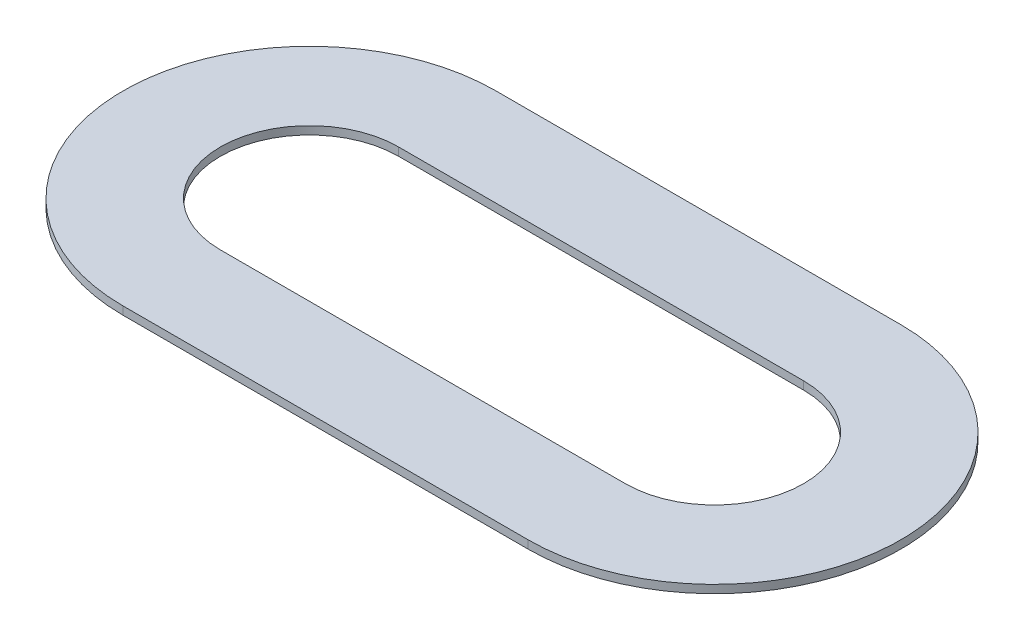
ISO-10303-21;
HEADER;
FILE_DESCRIPTION(('STEP AP214'),'2;1');
FILE_NAME('part.step','',(''),(''),'','','');
FILE_SCHEMA(('AUTOMOTIVE_DESIGN { 1 0 10303 214 1 1 1 1 }'));
ENDSEC;
DATA;
#1=APPLICATION_CONTEXT('core data for automotive mechanical design processes');
#2=APPLICATION_PROTOCOL_DEFINITION('international standard','automotive_design',2000,#1);
#3=PRODUCT_CONTEXT('',#1,'mechanical');
#4=PRODUCT('Part','Part','',(#3));
#5=PRODUCT_RELATED_PRODUCT_CATEGORY('part','',(#4));
#6=PRODUCT_DEFINITION_FORMATION('','',#4);
#7=PRODUCT_DEFINITION_CONTEXT('part definition',#1,'design');
#8=PRODUCT_DEFINITION('design','',#6,#7);
#9=PRODUCT_DEFINITION_SHAPE('','',#8);
#10=(LENGTH_UNIT() NAMED_UNIT(*) SI_UNIT(.MILLI.,.METRE.));
#11=(NAMED_UNIT(*) PLANE_ANGLE_UNIT() SI_UNIT($,.RADIAN.));
#12=(NAMED_UNIT(*) SI_UNIT($,.STERADIAN.) SOLID_ANGLE_UNIT());
#13=UNCERTAINTY_MEASURE_WITH_UNIT(LENGTH_MEASURE(1.E-05),#10,'distance_accuracy_value','');
#14=(GEOMETRIC_REPRESENTATION_CONTEXT(3) GLOBAL_UNCERTAINTY_ASSIGNED_CONTEXT((#13)) GLOBAL_UNIT_ASSIGNED_CONTEXT((#10,
#11,#12)) REPRESENTATION_CONTEXT('',''));
#15=CARTESIAN_POINT('',(0.,0.,0.));
#16=DIRECTION('',(0.,0.,1.));
#17=DIRECTION('',(1.,0.,0.));
#18=AXIS2_PLACEMENT_3D('',#15,#16,#17);
#19=CARTESIAN_POINT('',(-250.,10.,0.));
#20=DIRECTION('',(0.,1.,0.));
#21=DIRECTION('',(0.,0.,1.));
#22=AXIS2_PLACEMENT_3D('',#19,#20,#21);
#23=PLANE('',#22);
#24=CARTESIAN_POINT('',(-250.,10.,0.));
#25=DIRECTION('',(0.,1.,0.));
#26=DIRECTION('',(0.,0.,1.));
#27=AXIS2_PLACEMENT_3D('',#24,#25,#26);
#28=CIRCLE('',#27,230.);
#29=CARTESIAN_POINT('',(-250.,10.,-230.));
#30=VERTEX_POINT('',#29);
#31=CARTESIAN_POINT('',(-250.,10.,230.));
#32=VERTEX_POINT('',#31);
#33=EDGE_CURVE('E137',#30,#32,#28,.T.);
#34=ORIENTED_EDGE('',*,*,#33,.T.);
#35=DIRECTION('',(1.,0.,0.));
#36=VECTOR('',#35,1.);
#37=CARTESIAN_POINT('',(-250.,10.,230.));
#38=LINE('',#37,#36);
#39=CARTESIAN_POINT('',(250.,10.,230.));
#40=VERTEX_POINT('',#39);
#41=EDGE_CURVE('E140',#32,#40,#38,.T.);
#42=ORIENTED_EDGE('',*,*,#41,.T.);
#43=CARTESIAN_POINT('',(250.,10.,0.));
#44=DIRECTION('',(0.,1.,0.));
#45=DIRECTION('',(0.,0.,1.));
#46=AXIS2_PLACEMENT_3D('',#43,#44,#45);
#47=CIRCLE('',#46,230.);
#48=CARTESIAN_POINT('',(250.,10.,-230.));
#49=VERTEX_POINT('',#48);
#50=EDGE_CURVE('E143',#40,#49,#47,.T.);
#51=ORIENTED_EDGE('',*,*,#50,.T.);
#52=DIRECTION('',(-1.,0.,0.));
#53=VECTOR('',#52,1.);
#54=CARTESIAN_POINT('',(-250.,10.,-230.));
#55=LINE('',#54,#53);
#56=EDGE_CURVE('E145',#49,#30,#55,.T.);
#57=ORIENTED_EDGE('',*,*,#56,.T.);
#58=EDGE_LOOP('',(#34,#42,#51,#57));
#59=FACE_BOUND('',#58,.T.);
#60=DIRECTION('',(1.,0.,0.));
#61=VECTOR('',#60,1.);
#62=CARTESIAN_POINT('',(-250.,10.,110.));
#63=LINE('',#62,#61);
#64=CARTESIAN_POINT('',(-250.,10.,110.));
#65=VERTEX_POINT('',#64);
#66=CARTESIAN_POINT('',(250.,10.,110.));
#67=VERTEX_POINT('',#66);
#68=EDGE_CURVE('E109',#65,#67,#63,.T.);
#69=ORIENTED_EDGE('',*,*,#68,.F.);
#70=CARTESIAN_POINT('',(-250.,10.,0.));
#71=DIRECTION('',(0.,1.,0.));
#72=DIRECTION('',(0.,0.,1.));
#73=AXIS2_PLACEMENT_3D('',#70,#71,#72);
#74=CIRCLE('',#73,110.);
#75=CARTESIAN_POINT('',(-250.,10.,-110.));
#76=VERTEX_POINT('',#75);
#77=EDGE_CURVE('E101',#76,#65,#74,.T.);
#78=ORIENTED_EDGE('',*,*,#77,.F.);
#79=DIRECTION('',(-1.,0.,0.));
#80=VECTOR('',#79,1.);
#81=CARTESIAN_POINT('',(-250.,10.,-110.));
#82=LINE('',#81,#80);
#83=CARTESIAN_POINT('',(250.,10.,-110.));
#84=VERTEX_POINT('',#83);
#85=EDGE_CURVE('E123',#84,#76,#82,.T.);
#86=ORIENTED_EDGE('',*,*,#85,.F.);
#87=CARTESIAN_POINT('',(250.,10.,0.));
#88=DIRECTION('',(0.,1.,0.));
#89=DIRECTION('',(0.,0.,1.));
#90=AXIS2_PLACEMENT_3D('',#87,#88,#89);
#91=CIRCLE('',#90,110.);
#92=EDGE_CURVE('E121',#67,#84,#91,.T.);
#93=ORIENTED_EDGE('',*,*,#92,.F.);
#94=EDGE_LOOP('',(#69,#78,#86,#93));
#95=FACE_BOUND('',#94,.T.);
#96=ADVANCED_FACE('F36',(#59,#95),#23,.T.);
#97=CARTESIAN_POINT('',(-250.,0.,0.));
#98=DIRECTION('',(0.,1.,0.));
#99=DIRECTION('',(0.,0.,1.));
#100=AXIS2_PLACEMENT_3D('',#97,#98,#99);
#101=PLANE('',#100);
#102=CARTESIAN_POINT('',(-250.,0.,0.));
#103=DIRECTION('',(0.,1.,0.));
#104=DIRECTION('',(0.,0.,1.));
#105=AXIS2_PLACEMENT_3D('',#102,#103,#104);
#106=CIRCLE('',#105,230.);
#107=CARTESIAN_POINT('',(-250.,0.,-230.));
#108=VERTEX_POINT('',#107);
#109=CARTESIAN_POINT('',(-250.,0.,230.));
#110=VERTEX_POINT('',#109);
#111=EDGE_CURVE('E117',#108,#110,#106,.T.);
#112=ORIENTED_EDGE('',*,*,#111,.F.);
#113=DIRECTION('',(-1.,0.,0.));
#114=VECTOR('',#113,1.);
#115=CARTESIAN_POINT('',(-250.,0.,-230.));
#116=LINE('',#115,#114);
#117=CARTESIAN_POINT('',(250.,0.,-230.));
#118=VERTEX_POINT('',#117);
#119=EDGE_CURVE('E141',#118,#108,#116,.T.);
#120=ORIENTED_EDGE('',*,*,#119,.F.);
#121=CARTESIAN_POINT('',(250.,0.,0.));
#122=DIRECTION('',(0.,1.,0.));
#123=DIRECTION('',(0.,0.,1.));
#124=AXIS2_PLACEMENT_3D('',#121,#122,#123);
#125=CIRCLE('',#124,230.);
#126=CARTESIAN_POINT('',(250.,0.,230.));
#127=VERTEX_POINT('',#126);
#128=EDGE_CURVE('E152',#127,#118,#125,.T.);
#129=ORIENTED_EDGE('',*,*,#128,.F.);
#130=DIRECTION('',(1.,0.,0.));
#131=VECTOR('',#130,1.);
#132=CARTESIAN_POINT('',(-250.,0.,230.));
#133=LINE('',#132,#131);
#134=EDGE_CURVE('E150',#110,#127,#133,.T.);
#135=ORIENTED_EDGE('',*,*,#134,.F.);
#136=EDGE_LOOP('',(#112,#120,#129,#135));
#137=FACE_BOUND('',#136,.T.);
#138=CARTESIAN_POINT('',(-250.,0.,0.));
#139=DIRECTION('',(0.,1.,0.));
#140=DIRECTION('',(0.,0.,1.));
#141=AXIS2_PLACEMENT_3D('',#138,#139,#140);
#142=CIRCLE('',#141,110.);
#143=CARTESIAN_POINT('',(-250.,0.,-110.));
#144=VERTEX_POINT('',#143);
#145=CARTESIAN_POINT('',(-250.,0.,110.));
#146=VERTEX_POINT('',#145);
#147=EDGE_CURVE('E59',#144,#146,#142,.T.);
#148=ORIENTED_EDGE('',*,*,#147,.T.);
#149=DIRECTION('',(1.,0.,0.));
#150=VECTOR('',#149,1.);
#151=CARTESIAN_POINT('',(-250.,0.,110.));
#152=LINE('',#151,#150);
#153=CARTESIAN_POINT('',(250.,0.,110.));
#154=VERTEX_POINT('',#153);
#155=EDGE_CURVE('E116',#146,#154,#152,.T.);
#156=ORIENTED_EDGE('',*,*,#155,.T.);
#157=CARTESIAN_POINT('',(250.,0.,0.));
#158=DIRECTION('',(0.,1.,0.));
#159=DIRECTION('',(0.,0.,1.));
#160=AXIS2_PLACEMENT_3D('',#157,#158,#159);
#161=CIRCLE('',#160,110.);
#162=CARTESIAN_POINT('',(250.,0.,-110.));
#163=VERTEX_POINT('',#162);
#164=EDGE_CURVE('E129',#154,#163,#161,.T.);
#165=ORIENTED_EDGE('',*,*,#164,.T.);
#166=DIRECTION('',(-1.,0.,0.));
#167=VECTOR('',#166,1.);
#168=CARTESIAN_POINT('',(-250.,0.,-110.));
#169=LINE('',#168,#167);
#170=EDGE_CURVE('E110',#163,#144,#169,.T.);
#171=ORIENTED_EDGE('',*,*,#170,.T.);
#172=EDGE_LOOP('',(#148,#156,#165,#171));
#173=FACE_BOUND('',#172,.T.);
#174=ADVANCED_FACE('F170',(#137,#173),#101,.F.);
#175=CARTESIAN_POINT('',(-250.,10.,0.));
#176=DIRECTION('',(0.,-1.,0.));
#177=DIRECTION('',(0.,0.,-1.));
#178=AXIS2_PLACEMENT_3D('',#175,#176,#177);
#179=CYLINDRICAL_SURFACE('',#178,230.);
#180=ORIENTED_EDGE('',*,*,#111,.T.);
#181=DIRECTION('',(0.,-1.,0.));
#182=VECTOR('',#181,1.);
#183=CARTESIAN_POINT('',(-250.,10.,230.));
#184=LINE('',#183,#182);
#185=EDGE_CURVE('E11',#32,#110,#184,.T.);
#186=ORIENTED_EDGE('',*,*,#185,.F.);
#187=ORIENTED_EDGE('',*,*,#33,.F.);
#188=DIRECTION('',(0.,-1.,0.));
#189=VECTOR('',#188,1.);
#190=CARTESIAN_POINT('',(-250.,10.,-230.));
#191=LINE('',#190,#189);
#192=EDGE_CURVE('E147',#30,#108,#191,.T.);
#193=ORIENTED_EDGE('',*,*,#192,.T.);
#194=EDGE_LOOP('',(#180,#186,#187,#193));
#195=FACE_BOUND('',#194,.T.);
#196=ADVANCED_FACE('F38',(#195),#179,.T.);
#197=CARTESIAN_POINT('',(-250.,10.,230.));
#198=DIRECTION('',(0.,0.,-1.));
#199=DIRECTION('',(-1.,0.,0.));
#200=AXIS2_PLACEMENT_3D('',#197,#198,#199);
#201=PLANE('',#200);
#202=ORIENTED_EDGE('',*,*,#134,.T.);
#203=DIRECTION('',(0.,-1.,0.));
#204=VECTOR('',#203,1.);
#205=CARTESIAN_POINT('',(250.,10.,230.));
#206=LINE('',#205,#204);
#207=EDGE_CURVE('E44',#40,#127,#206,.T.);
#208=ORIENTED_EDGE('',*,*,#207,.F.);
#209=ORIENTED_EDGE('',*,*,#41,.F.);
#210=ORIENTED_EDGE('',*,*,#185,.T.);
#211=EDGE_LOOP('',(#202,#208,#209,#210));
#212=FACE_BOUND('',#211,.T.);
#213=ADVANCED_FACE('F180',(#212),#201,.F.);
#214=CARTESIAN_POINT('',(250.,10.,0.));
#215=DIRECTION('',(0.,-1.,0.));
#216=DIRECTION('',(0.,0.,-1.));
#217=AXIS2_PLACEMENT_3D('',#214,#215,#216);
#218=CYLINDRICAL_SURFACE('',#217,230.);
#219=ORIENTED_EDGE('',*,*,#128,.T.);
#220=DIRECTION('',(0.,-1.,0.));
#221=VECTOR('',#220,1.);
#222=CARTESIAN_POINT('',(250.,10.,-230.));
#223=LINE('',#222,#221);
#224=EDGE_CURVE('E157',#49,#118,#223,.T.);
#225=ORIENTED_EDGE('',*,*,#224,.F.);
#226=ORIENTED_EDGE('',*,*,#50,.F.);
#227=ORIENTED_EDGE('',*,*,#207,.T.);
#228=EDGE_LOOP('',(#219,#225,#226,#227));
#229=FACE_BOUND('',#228,.T.);
#230=ADVANCED_FACE('F164',(#229),#218,.T.);
#231=CARTESIAN_POINT('',(-250.,10.,-230.));
#232=DIRECTION('',(0.,0.,1.));
#233=DIRECTION('',(1.,0.,0.));
#234=AXIS2_PLACEMENT_3D('',#231,#232,#233);
#235=PLANE('',#234);
#236=ORIENTED_EDGE('',*,*,#119,.T.);
#237=ORIENTED_EDGE('',*,*,#192,.F.);
#238=ORIENTED_EDGE('',*,*,#56,.F.);
#239=ORIENTED_EDGE('',*,*,#224,.T.);
#240=EDGE_LOOP('',(#236,#237,#238,#239));
#241=FACE_BOUND('',#240,.T.);
#242=ADVANCED_FACE('F174',(#241),#235,.F.);
#243=CARTESIAN_POINT('',(-250.,10.,0.));
#244=DIRECTION('',(0.,-1.,0.));
#245=DIRECTION('',(0.,0.,-1.));
#246=AXIS2_PLACEMENT_3D('',#243,#244,#245);
#247=CYLINDRICAL_SURFACE('',#246,110.);
#248=ORIENTED_EDGE('',*,*,#147,.F.);
#249=DIRECTION('',(0.,-1.,0.));
#250=VECTOR('',#249,1.);
#251=CARTESIAN_POINT('',(-250.,10.,-110.));
#252=LINE('',#251,#250);
#253=EDGE_CURVE('E105',#76,#144,#252,.T.);
#254=ORIENTED_EDGE('',*,*,#253,.F.);
#255=ORIENTED_EDGE('',*,*,#77,.T.);
#256=DIRECTION('',(0.,-1.,0.));
#257=VECTOR('',#256,1.);
#258=CARTESIAN_POINT('',(-250.,10.,110.));
#259=LINE('',#258,#257);
#260=EDGE_CURVE('E104',#65,#146,#259,.T.);
#261=ORIENTED_EDGE('',*,*,#260,.T.);
#262=EDGE_LOOP('',(#248,#254,#255,#261));
#263=FACE_BOUND('',#262,.T.);
#264=ADVANCED_FACE('F103',(#263),#247,.F.);
#265=CARTESIAN_POINT('',(-250.,10.,110.));
#266=DIRECTION('',(0.,0.,-1.));
#267=DIRECTION('',(-1.,0.,0.));
#268=AXIS2_PLACEMENT_3D('',#265,#266,#267);
#269=PLANE('',#268);
#270=ORIENTED_EDGE('',*,*,#155,.F.);
#271=ORIENTED_EDGE('',*,*,#260,.F.);
#272=ORIENTED_EDGE('',*,*,#68,.T.);
#273=DIRECTION('',(0.,-1.,0.));
#274=VECTOR('',#273,1.);
#275=CARTESIAN_POINT('',(250.,10.,110.));
#276=LINE('',#275,#274);
#277=EDGE_CURVE('E118',#67,#154,#276,.T.);
#278=ORIENTED_EDGE('',*,*,#277,.T.);
#279=EDGE_LOOP('',(#270,#271,#272,#278));
#280=FACE_BOUND('',#279,.T.);
#281=ADVANCED_FACE('F113',(#280),#269,.T.);
#282=CARTESIAN_POINT('',(250.,10.,0.));
#283=DIRECTION('',(0.,-1.,0.));
#284=DIRECTION('',(0.,0.,-1.));
#285=AXIS2_PLACEMENT_3D('',#282,#283,#284);
#286=CYLINDRICAL_SURFACE('',#285,110.);
#287=ORIENTED_EDGE('',*,*,#164,.F.);
#288=ORIENTED_EDGE('',*,*,#277,.F.);
#289=ORIENTED_EDGE('',*,*,#92,.T.);
#290=DIRECTION('',(0.,-1.,0.));
#291=VECTOR('',#290,1.);
#292=CARTESIAN_POINT('',(250.,10.,-110.));
#293=LINE('',#292,#291);
#294=EDGE_CURVE('E51',#84,#163,#293,.T.);
#295=ORIENTED_EDGE('',*,*,#294,.T.);
#296=EDGE_LOOP('',(#287,#288,#289,#295));
#297=FACE_BOUND('',#296,.T.);
#298=ADVANCED_FACE('F203',(#297),#286,.F.);
#299=CARTESIAN_POINT('',(-250.,10.,-110.));
#300=DIRECTION('',(0.,0.,1.));
#301=DIRECTION('',(1.,0.,0.));
#302=AXIS2_PLACEMENT_3D('',#299,#300,#301);
#303=PLANE('',#302);
#304=ORIENTED_EDGE('',*,*,#170,.F.);
#305=ORIENTED_EDGE('',*,*,#294,.F.);
#306=ORIENTED_EDGE('',*,*,#85,.T.);
#307=ORIENTED_EDGE('',*,*,#253,.T.);
#308=EDGE_LOOP('',(#304,#305,#306,#307));
#309=FACE_BOUND('',#308,.T.);
#310=ADVANCED_FACE('F207',(#309),#303,.T.);
#311=CLOSED_SHELL('',(#96,#174,#196,#213,#230,#242,#264,#281,#298,#310));
#312=MANIFOLD_SOLID_BREP('B2',#311);
#313=ADVANCED_BREP_SHAPE_REPRESENTATION('',(#18,#312),#14);
#314=SHAPE_DEFINITION_REPRESENTATION(#9,#313);
ENDSEC;
END-ISO-10303-21;
